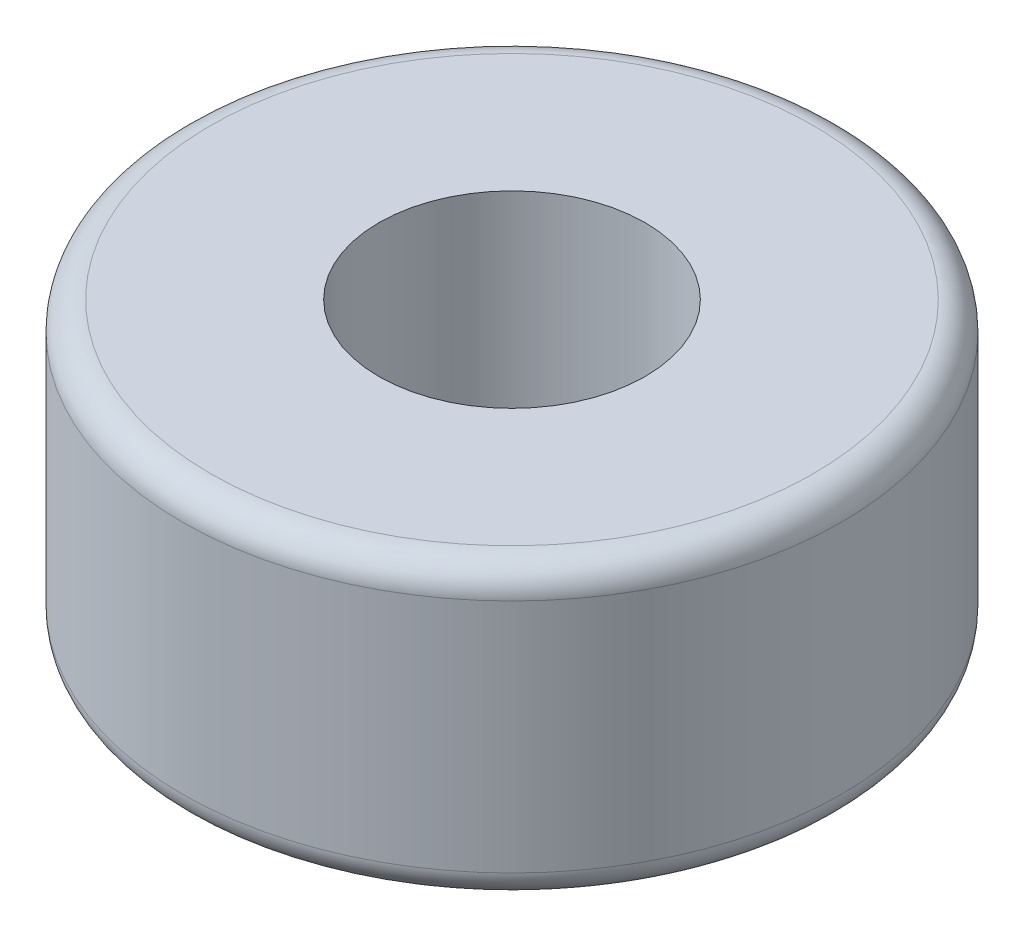
ISO-10303-21;
HEADER;
FILE_DESCRIPTION(('STEP AP214'),'2;1');
FILE_NAME('part.step','',(''),(''),'','','');
FILE_SCHEMA(('AUTOMOTIVE_DESIGN { 1 0 10303 214 1 1 1 1 }'));
ENDSEC;
DATA;
#1=APPLICATION_CONTEXT('core data for automotive mechanical design processes');
#2=APPLICATION_PROTOCOL_DEFINITION('international standard','automotive_design',2000,#1);
#3=PRODUCT_CONTEXT('',#1,'mechanical');
#4=PRODUCT('Part','Part','',(#3));
#5=PRODUCT_RELATED_PRODUCT_CATEGORY('part','',(#4));
#6=PRODUCT_DEFINITION_FORMATION('','',#4);
#7=PRODUCT_DEFINITION_CONTEXT('part definition',#1,'design');
#8=PRODUCT_DEFINITION('design','',#6,#7);
#9=PRODUCT_DEFINITION_SHAPE('','',#8);
#10=(LENGTH_UNIT() NAMED_UNIT(*) SI_UNIT(.MILLI.,.METRE.));
#11=(NAMED_UNIT(*) PLANE_ANGLE_UNIT() SI_UNIT($,.RADIAN.));
#12=(NAMED_UNIT(*) SI_UNIT($,.STERADIAN.) SOLID_ANGLE_UNIT());
#13=UNCERTAINTY_MEASURE_WITH_UNIT(LENGTH_MEASURE(1.E-05),#10,'distance_accuracy_value','');
#14=(GEOMETRIC_REPRESENTATION_CONTEXT(3) GLOBAL_UNCERTAINTY_ASSIGNED_CONTEXT((#13)) GLOBAL_UNIT_ASSIGNED_CONTEXT((#10,
#11,#12)) REPRESENTATION_CONTEXT('',''));
#15=CARTESIAN_POINT('',(0.,0.,0.));
#16=DIRECTION('',(0.,0.,1.));
#17=DIRECTION('',(1.,0.,0.));
#18=AXIS2_PLACEMENT_3D('',#15,#16,#17);
#19=CARTESIAN_POINT('',(0.,5.2,0.));
#20=DIRECTION('',(0.,1.,0.));
#21=DIRECTION('',(0.,0.,1.));
#22=AXIS2_PLACEMENT_3D('',#19,#20,#21);
#23=PLANE('',#22);
#24=CARTESIAN_POINT('',(0.,5.2,0.));
#25=DIRECTION('',(0.,1.,0.));
#26=DIRECTION('',(0.,0.,1.));
#27=AXIS2_PLACEMENT_3D('',#24,#25,#26);
#28=CIRCLE('',#27,5.375);
#29=CARTESIAN_POINT('',(0.,5.2,5.375));
#30=VERTEX_POINT('',#29);
#31=EDGE_CURVE('E10',#30,#30,#28,.T.);
#32=ORIENTED_EDGE('',*,*,#31,.T.);
#33=EDGE_LOOP('',(#32));
#34=FACE_BOUND('',#33,.T.);
#35=CARTESIAN_POINT('',(0.,5.2,0.));
#36=DIRECTION('',(0.,1.,0.));
#37=DIRECTION('',(0.,0.,1.));
#38=AXIS2_PLACEMENT_3D('',#35,#36,#37);
#39=CIRCLE('',#38,2.375);
#40=CARTESIAN_POINT('',(0.,5.2,2.375));
#41=VERTEX_POINT('',#40);
#42=EDGE_CURVE('E52',#41,#41,#39,.T.);
#43=ORIENTED_EDGE('',*,*,#42,.F.);
#44=EDGE_LOOP('',(#43));
#45=FACE_BOUND('',#44,.T.);
#46=ADVANCED_FACE('F32',(#34,#45),#23,.T.);
#47=CARTESIAN_POINT('',(0.,0.,0.));
#48=DIRECTION('',(0.,1.,0.));
#49=DIRECTION('',(0.,0.,1.));
#50=AXIS2_PLACEMENT_3D('',#47,#48,#49);
#51=PLANE('',#50);
#52=CARTESIAN_POINT('',(0.,0.,0.));
#53=DIRECTION('',(0.,1.,0.));
#54=DIRECTION('',(0.,0.,1.));
#55=AXIS2_PLACEMENT_3D('',#52,#53,#54);
#56=CIRCLE('',#55,5.375);
#57=CARTESIAN_POINT('',(0.,0.,5.375));
#58=VERTEX_POINT('',#57);
#59=EDGE_CURVE('E39',#58,#58,#56,.F.);
#60=ORIENTED_EDGE('',*,*,#59,.T.);
#61=EDGE_LOOP('',(#60));
#62=FACE_BOUND('',#61,.T.);
#63=CARTESIAN_POINT('',(0.,0.,0.));
#64=DIRECTION('',(0.,1.,0.));
#65=DIRECTION('',(0.,0.,1.));
#66=AXIS2_PLACEMENT_3D('',#63,#64,#65);
#67=CIRCLE('',#66,2.375);
#68=CARTESIAN_POINT('',(0.,0.,2.375));
#69=VERTEX_POINT('',#68);
#70=EDGE_CURVE('E53',#69,#69,#67,.T.);
#71=ORIENTED_EDGE('',*,*,#70,.T.);
#72=EDGE_LOOP('',(#71));
#73=FACE_BOUND('',#72,.T.);
#74=ADVANCED_FACE('F63',(#62,#73),#51,.F.);
#75=CARTESIAN_POINT('',(0.,5.2,0.));
#76=DIRECTION('',(0.,-1.,0.));
#77=DIRECTION('',(0.,0.,-1.));
#78=AXIS2_PLACEMENT_3D('',#75,#76,#77);
#79=CYLINDRICAL_SURFACE('',#78,5.875);
#80=CARTESIAN_POINT('',(0.,0.5,0.));
#81=DIRECTION('',(0.,1.,0.));
#82=DIRECTION('',(0.,0.,1.));
#83=AXIS2_PLACEMENT_3D('',#80,#81,#82);
#84=CIRCLE('',#83,5.875);
#85=CARTESIAN_POINT('',(0.,0.5,5.875));
#86=VERTEX_POINT('',#85);
#87=EDGE_CURVE('E43',#86,#86,#84,.T.);
#88=ORIENTED_EDGE('',*,*,#87,.T.);
#89=EDGE_LOOP('',(#88));
#90=FACE_BOUND('',#89,.T.);
#91=CARTESIAN_POINT('',(0.,4.7,0.));
#92=DIRECTION('',(0.,1.,0.));
#93=DIRECTION('',(0.,0.,1.));
#94=AXIS2_PLACEMENT_3D('',#91,#92,#93);
#95=CIRCLE('',#94,5.875);
#96=CARTESIAN_POINT('',(0.,4.7,5.875));
#97=VERTEX_POINT('',#96);
#98=EDGE_CURVE('E47',#97,#97,#95,.F.);
#99=ORIENTED_EDGE('',*,*,#98,.T.);
#100=EDGE_LOOP('',(#99));
#101=FACE_BOUND('',#100,.T.);
#102=ADVANCED_FACE('F68',(#90,#101),#79,.T.);
#103=CARTESIAN_POINT('',(0.,5.2,0.));
#104=DIRECTION('',(0.,-1.,0.));
#105=DIRECTION('',(0.,0.,-1.));
#106=AXIS2_PLACEMENT_3D('',#103,#104,#105);
#107=CYLINDRICAL_SURFACE('',#106,2.375);
#108=ORIENTED_EDGE('',*,*,#42,.T.);
#109=EDGE_LOOP('',(#108));
#110=FACE_BOUND('',#109,.T.);
#111=ORIENTED_EDGE('',*,*,#70,.F.);
#112=EDGE_LOOP('',(#111));
#113=FACE_BOUND('',#112,.T.);
#114=ADVANCED_FACE('F59',(#110,#113),#107,.F.);
#115=CARTESIAN_POINT('',(0.,0.5,0.));
#116=DIRECTION('',(0.,1.,0.));
#117=DIRECTION('',(0.,0.,1.));
#118=AXIS2_PLACEMENT_3D('',#115,#116,#117);
#119=TOROIDAL_SURFACE('',#118,5.375,0.5);
#120=ORIENTED_EDGE('',*,*,#59,.F.);
#121=EDGE_LOOP('',(#120));
#122=FACE_BOUND('',#121,.T.);
#123=ORIENTED_EDGE('',*,*,#87,.F.);
#124=EDGE_LOOP('',(#123));
#125=FACE_BOUND('',#124,.T.);
#126=ADVANCED_FACE('F74',(#122,#125),#119,.T.);
#127=CARTESIAN_POINT('',(0.,4.7,0.));
#128=DIRECTION('',(0.,1.,0.));
#129=DIRECTION('',(0.,0.,1.));
#130=AXIS2_PLACEMENT_3D('',#127,#128,#129);
#131=TOROIDAL_SURFACE('',#130,5.375,0.5);
#132=ORIENTED_EDGE('',*,*,#98,.F.);
#133=EDGE_LOOP('',(#132));
#134=FACE_BOUND('',#133,.T.);
#135=ORIENTED_EDGE('',*,*,#31,.F.);
#136=EDGE_LOOP('',(#135));
#137=FACE_BOUND('',#136,.T.);
#138=ADVANCED_FACE('F34',(#134,#137),#131,.T.);
#139=CLOSED_SHELL('',(#46,#74,#102,#114,#126,#138));
#140=MANIFOLD_SOLID_BREP('B2',#139);
#141=ADVANCED_BREP_SHAPE_REPRESENTATION('',(#18,#140),#14);
#142=SHAPE_DEFINITION_REPRESENTATION(#9,#141);
ENDSEC;
END-ISO-10303-21;
